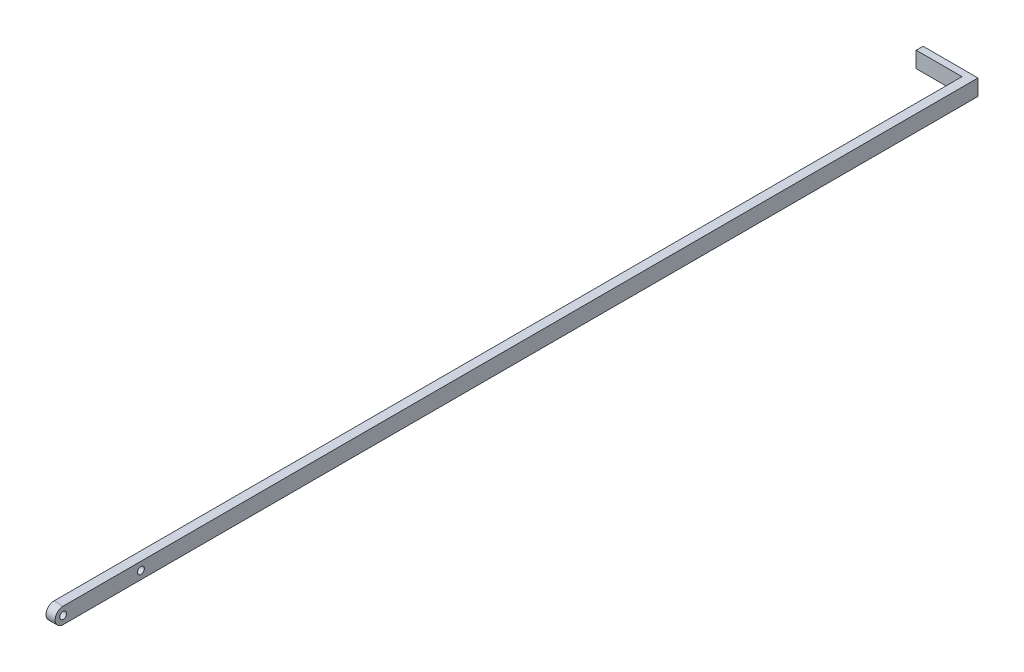
ISO-10303-21;
HEADER;
FILE_DESCRIPTION(('STEP AP214'),'2;1');
FILE_NAME('part.step','',(''),(''),'','','');
FILE_SCHEMA(('AUTOMOTIVE_DESIGN { 1 0 10303 214 1 1 1 1 }'));
ENDSEC;
DATA;
#1=APPLICATION_CONTEXT('core data for automotive mechanical design processes');
#2=APPLICATION_PROTOCOL_DEFINITION('international standard','automotive_design',2000,#1);
#3=PRODUCT_CONTEXT('',#1,'mechanical');
#4=PRODUCT('Part','Part','',(#3));
#5=PRODUCT_RELATED_PRODUCT_CATEGORY('part','',(#4));
#6=PRODUCT_DEFINITION_FORMATION('','',#4);
#7=PRODUCT_DEFINITION_CONTEXT('part definition',#1,'design');
#8=PRODUCT_DEFINITION('design','',#6,#7);
#9=PRODUCT_DEFINITION_SHAPE('','',#8);
#10=(LENGTH_UNIT() NAMED_UNIT(*) SI_UNIT(.MILLI.,.METRE.));
#11=(NAMED_UNIT(*) PLANE_ANGLE_UNIT() SI_UNIT($,.RADIAN.));
#12=(NAMED_UNIT(*) SI_UNIT($,.STERADIAN.) SOLID_ANGLE_UNIT());
#13=UNCERTAINTY_MEASURE_WITH_UNIT(LENGTH_MEASURE(1.E-05),#10,'distance_accuracy_value','');
#14=(GEOMETRIC_REPRESENTATION_CONTEXT(3) GLOBAL_UNCERTAINTY_ASSIGNED_CONTEXT((#13)) GLOBAL_UNIT_ASSIGNED_CONTEXT((#10,
#11,#12)) REPRESENTATION_CONTEXT('',''));
#15=CARTESIAN_POINT('',(0.,0.,0.));
#16=DIRECTION('',(0.,0.,1.));
#17=DIRECTION('',(1.,0.,0.));
#18=AXIS2_PLACEMENT_3D('',#15,#16,#17);
#19=CARTESIAN_POINT('',(4.,3.5,0.));
#20=DIRECTION('',(1.,0.,0.));
#21=DIRECTION('',(0.,0.,-1.));
#22=AXIS2_PLACEMENT_3D('',#19,#20,#21);
#23=PLANE('',#22);
#24=CARTESIAN_POINT('',(4.,3.5,0.));
#25=DIRECTION('',(1.,0.,0.));
#26=DIRECTION('',(0.,0.,-1.));
#27=AXIS2_PLACEMENT_3D('',#24,#25,#26);
#28=CIRCLE('',#27,1.5);
#29=CARTESIAN_POINT('',(4.,3.5,-1.5));
#30=VERTEX_POINT('',#29);
#31=EDGE_CURVE('E146',#30,#30,#28,.T.);
#32=ORIENTED_EDGE('',*,*,#31,.F.);
#33=EDGE_LOOP('',(#32));
#34=FACE_BOUND('',#33,.T.);
#35=CARTESIAN_POINT('',(4.,3.5,0.));
#36=DIRECTION('',(1.,0.,0.));
#37=DIRECTION('',(0.,0.,-1.));
#38=AXIS2_PLACEMENT_3D('',#35,#36,#37);
#39=CIRCLE('',#38,3.5);
#40=CARTESIAN_POINT('',(4.,7.,0.));
#41=VERTEX_POINT('',#40);
#42=CARTESIAN_POINT('',(4.,0.,0.));
#43=VERTEX_POINT('',#42);
#44=EDGE_CURVE('E154',#41,#43,#39,.T.);
#45=ORIENTED_EDGE('',*,*,#44,.T.);
#46=DIRECTION('',(0.,0.,-1.));
#47=VECTOR('',#46,1.);
#48=CARTESIAN_POINT('',(4.,0.,0.));
#49=LINE('',#48,#47);
#50=CARTESIAN_POINT('',(4.,0.,-400.));
#51=VERTEX_POINT('',#50);
#52=EDGE_CURVE('E90',#43,#51,#49,.T.);
#53=ORIENTED_EDGE('',*,*,#52,.T.);
#54=DIRECTION('',(0.,1.,0.));
#55=VECTOR('',#54,1.);
#56=CARTESIAN_POINT('',(4.,7.,-400.));
#57=LINE('',#56,#55);
#58=CARTESIAN_POINT('',(4.,7.,-400.));
#59=VERTEX_POINT('',#58);
#60=EDGE_CURVE('E159',#51,#59,#57,.T.);
#61=ORIENTED_EDGE('',*,*,#60,.T.);
#62=DIRECTION('',(0.,0.,1.));
#63=VECTOR('',#62,1.);
#64=CARTESIAN_POINT('',(4.,7.,0.));
#65=LINE('',#64,#63);
#66=EDGE_CURVE('E68',#59,#41,#65,.T.);
#67=ORIENTED_EDGE('',*,*,#66,.T.);
#68=EDGE_LOOP('',(#45,#53,#61,#67));
#69=FACE_BOUND('',#68,.T.);
#70=CARTESIAN_POINT('',(4.,3.5,-34.));
#71=DIRECTION('',(1.,0.,0.));
#72=DIRECTION('',(0.,0.,-1.));
#73=AXIS2_PLACEMENT_3D('',#70,#71,#72);
#74=CIRCLE('',#73,1.5);
#75=CARTESIAN_POINT('',(4.,3.5,-35.5));
#76=VERTEX_POINT('',#75);
#77=EDGE_CURVE('E138',#76,#76,#74,.T.);
#78=ORIENTED_EDGE('',*,*,#77,.F.);
#79=EDGE_LOOP('',(#78));
#80=FACE_BOUND('',#79,.T.);
#81=ADVANCED_FACE('F43',(#34,#69,#80),#23,.T.);
#82=CARTESIAN_POINT('',(0.,3.5,0.));
#83=DIRECTION('',(1.,0.,0.));
#84=DIRECTION('',(0.,0.,-1.));
#85=AXIS2_PLACEMENT_3D('',#82,#83,#84);
#86=PLANE('',#85);
#87=DIRECTION('',(0.,0.,1.));
#88=VECTOR('',#87,1.);
#89=CARTESIAN_POINT('',(0.,7.,0.));
#90=LINE('',#89,#88);
#91=CARTESIAN_POINT('',(0.,7.,-397.));
#92=VERTEX_POINT('',#91);
#93=CARTESIAN_POINT('',(0.,7.,0.));
#94=VERTEX_POINT('',#93);
#95=EDGE_CURVE('E83',#92,#94,#90,.T.);
#96=ORIENTED_EDGE('',*,*,#95,.F.);
#97=DIRECTION('',(0.,-1.,0.));
#98=VECTOR('',#97,1.);
#99=CARTESIAN_POINT('',(0.,7.,-397.));
#100=LINE('',#99,#98);
#101=CARTESIAN_POINT('',(0.,0.,-397.));
#102=VERTEX_POINT('',#101);
#103=EDGE_CURVE('E126',#92,#102,#100,.T.);
#104=ORIENTED_EDGE('',*,*,#103,.T.);
#105=DIRECTION('',(0.,0.,-1.));
#106=VECTOR('',#105,1.);
#107=CARTESIAN_POINT('',(0.,0.,0.));
#108=LINE('',#107,#106);
#109=CARTESIAN_POINT('',(0.,0.,0.));
#110=VERTEX_POINT('',#109);
#111=EDGE_CURVE('E124',#110,#102,#108,.T.);
#112=ORIENTED_EDGE('',*,*,#111,.F.);
#113=CARTESIAN_POINT('',(0.,3.5,0.));
#114=DIRECTION('',(1.,0.,0.));
#115=DIRECTION('',(0.,0.,-1.));
#116=AXIS2_PLACEMENT_3D('',#113,#114,#115);
#117=CIRCLE('',#116,3.5);
#118=EDGE_CURVE('E150',#94,#110,#117,.T.);
#119=ORIENTED_EDGE('',*,*,#118,.F.);
#120=EDGE_LOOP('',(#96,#104,#112,#119));
#121=FACE_BOUND('',#120,.T.);
#122=CARTESIAN_POINT('',(0.,3.5,0.));
#123=DIRECTION('',(1.,0.,0.));
#124=DIRECTION('',(0.,0.,-1.));
#125=AXIS2_PLACEMENT_3D('',#122,#123,#124);
#126=CIRCLE('',#125,1.5);
#127=CARTESIAN_POINT('',(0.,3.5,-1.5));
#128=VERTEX_POINT('',#127);
#129=EDGE_CURVE('E142',#128,#128,#126,.T.);
#130=ORIENTED_EDGE('',*,*,#129,.T.);
#131=EDGE_LOOP('',(#130));
#132=FACE_BOUND('',#131,.T.);
#133=CARTESIAN_POINT('',(0.,3.5,-34.));
#134=DIRECTION('',(1.,0.,0.));
#135=DIRECTION('',(0.,0.,-1.));
#136=AXIS2_PLACEMENT_3D('',#133,#134,#135);
#137=CIRCLE('',#136,1.5);
#138=CARTESIAN_POINT('',(0.,3.5,-35.5));
#139=VERTEX_POINT('',#138);
#140=EDGE_CURVE('E136',#139,#139,#137,.T.);
#141=ORIENTED_EDGE('',*,*,#140,.T.);
#142=EDGE_LOOP('',(#141));
#143=FACE_BOUND('',#142,.T.);
#144=ADVANCED_FACE('F187',(#121,#132,#143),#86,.F.);
#145=CARTESIAN_POINT('',(4.,3.5,0.));
#146=DIRECTION('',(-1.,0.,0.));
#147=DIRECTION('',(0.,0.,1.));
#148=AXIS2_PLACEMENT_3D('',#145,#146,#147);
#149=CYLINDRICAL_SURFACE('',#148,3.5);
#150=ORIENTED_EDGE('',*,*,#118,.T.);
#151=DIRECTION('',(-1.,0.,0.));
#152=VECTOR('',#151,1.);
#153=CARTESIAN_POINT('',(4.,0.,0.));
#154=LINE('',#153,#152);
#155=EDGE_CURVE('E11',#43,#110,#154,.T.);
#156=ORIENTED_EDGE('',*,*,#155,.F.);
#157=ORIENTED_EDGE('',*,*,#44,.F.);
#158=DIRECTION('',(-1.,0.,0.));
#159=VECTOR('',#158,1.);
#160=CARTESIAN_POINT('',(4.,7.,0.));
#161=LINE('',#160,#159);
#162=EDGE_CURVE('E164',#41,#94,#161,.T.);
#163=ORIENTED_EDGE('',*,*,#162,.T.);
#164=EDGE_LOOP('',(#150,#156,#157,#163));
#165=FACE_BOUND('',#164,.T.);
#166=ADVANCED_FACE('F45',(#165),#149,.T.);
#167=CARTESIAN_POINT('',(4.,0.,0.));
#168=DIRECTION('',(0.,1.,0.));
#169=DIRECTION('',(0.,0.,1.));
#170=AXIS2_PLACEMENT_3D('',#167,#168,#169);
#171=PLANE('',#170);
#172=ORIENTED_EDGE('',*,*,#111,.T.);
#173=DIRECTION('',(-1.,0.,0.));
#174=VECTOR('',#173,1.);
#175=CARTESIAN_POINT('',(-20.,0.,-397.));
#176=LINE('',#175,#174);
#177=CARTESIAN_POINT('',(-20.,0.,-397.));
#178=VERTEX_POINT('',#177);
#179=EDGE_CURVE('E59',#102,#178,#176,.T.);
#180=ORIENTED_EDGE('',*,*,#179,.T.);
#181=DIRECTION('',(0.,0.,-1.));
#182=VECTOR('',#181,1.);
#183=CARTESIAN_POINT('',(-20.,0.,-397.));
#184=LINE('',#183,#182);
#185=CARTESIAN_POINT('',(-20.,0.,-400.));
#186=VERTEX_POINT('',#185);
#187=EDGE_CURVE('E108',#178,#186,#184,.T.);
#188=ORIENTED_EDGE('',*,*,#187,.T.);
#189=DIRECTION('',(-1.,0.,0.));
#190=VECTOR('',#189,1.);
#191=CARTESIAN_POINT('',(4.,0.,-400.));
#192=LINE('',#191,#190);
#193=EDGE_CURVE('E52',#51,#186,#192,.T.);
#194=ORIENTED_EDGE('',*,*,#193,.F.);
#195=ORIENTED_EDGE('',*,*,#52,.F.);
#196=ORIENTED_EDGE('',*,*,#155,.T.);
#197=EDGE_LOOP('',(#172,#180,#188,#194,#195,#196));
#198=FACE_BOUND('',#197,.T.);
#199=ADVANCED_FACE('F123',(#198),#171,.F.);
#200=CARTESIAN_POINT('',(4.,7.,-400.));
#201=DIRECTION('',(0.,0.,1.));
#202=DIRECTION('',(1.,0.,0.));
#203=AXIS2_PLACEMENT_3D('',#200,#201,#202);
#204=PLANE('',#203);
#205=ORIENTED_EDGE('',*,*,#193,.T.);
#206=DIRECTION('',(0.,1.,0.));
#207=VECTOR('',#206,1.);
#208=CARTESIAN_POINT('',(-20.,7.,-400.));
#209=LINE('',#208,#207);
#210=CARTESIAN_POINT('',(-20.,7.,-400.));
#211=VERTEX_POINT('',#210);
#212=EDGE_CURVE('E114',#186,#211,#209,.T.);
#213=ORIENTED_EDGE('',*,*,#212,.T.);
#214=DIRECTION('',(-1.,0.,0.));
#215=VECTOR('',#214,1.);
#216=CARTESIAN_POINT('',(4.,7.,-400.));
#217=LINE('',#216,#215);
#218=EDGE_CURVE('E174',#59,#211,#217,.T.);
#219=ORIENTED_EDGE('',*,*,#218,.F.);
#220=ORIENTED_EDGE('',*,*,#60,.F.);
#221=EDGE_LOOP('',(#205,#213,#219,#220));
#222=FACE_BOUND('',#221,.T.);
#223=ADVANCED_FACE('F179',(#222),#204,.F.);
#224=CARTESIAN_POINT('',(4.,7.,0.));
#225=DIRECTION('',(0.,-1.,0.));
#226=DIRECTION('',(0.,0.,-1.));
#227=AXIS2_PLACEMENT_3D('',#224,#225,#226);
#228=PLANE('',#227);
#229=ORIENTED_EDGE('',*,*,#218,.T.);
#230=DIRECTION('',(0.,0.,-1.));
#231=VECTOR('',#230,1.);
#232=CARTESIAN_POINT('',(-20.,7.,-397.));
#233=LINE('',#232,#231);
#234=CARTESIAN_POINT('',(-20.,7.,-397.));
#235=VERTEX_POINT('',#234);
#236=EDGE_CURVE('E116',#235,#211,#233,.T.);
#237=ORIENTED_EDGE('',*,*,#236,.F.);
#238=DIRECTION('',(1.,0.,0.));
#239=VECTOR('',#238,1.);
#240=CARTESIAN_POINT('',(0.,7.,-397.));
#241=LINE('',#240,#239);
#242=EDGE_CURVE('E117',#235,#92,#241,.T.);
#243=ORIENTED_EDGE('',*,*,#242,.T.);
#244=ORIENTED_EDGE('',*,*,#95,.T.);
#245=ORIENTED_EDGE('',*,*,#162,.F.);
#246=ORIENTED_EDGE('',*,*,#66,.F.);
#247=EDGE_LOOP('',(#229,#237,#243,#244,#245,#246));
#248=FACE_BOUND('',#247,.T.);
#249=ADVANCED_FACE('F189',(#248),#228,.F.);
#250=CARTESIAN_POINT('',(4.,3.5,0.));
#251=DIRECTION('',(-1.,0.,0.));
#252=DIRECTION('',(0.,0.,1.));
#253=AXIS2_PLACEMENT_3D('',#250,#251,#252);
#254=CYLINDRICAL_SURFACE('',#253,1.5);
#255=ORIENTED_EDGE('',*,*,#31,.T.);
#256=EDGE_LOOP('',(#255));
#257=FACE_BOUND('',#256,.T.);
#258=ORIENTED_EDGE('',*,*,#129,.F.);
#259=EDGE_LOOP('',(#258));
#260=FACE_BOUND('',#259,.T.);
#261=ADVANCED_FACE('F191',(#257,#260),#254,.F.);
#262=CARTESIAN_POINT('',(4.,3.5,-34.));
#263=DIRECTION('',(-1.,0.,0.));
#264=DIRECTION('',(0.,0.,1.));
#265=AXIS2_PLACEMENT_3D('',#262,#263,#264);
#266=CYLINDRICAL_SURFACE('',#265,1.5);
#267=ORIENTED_EDGE('',*,*,#77,.T.);
#268=EDGE_LOOP('',(#267));
#269=FACE_BOUND('',#268,.T.);
#270=ORIENTED_EDGE('',*,*,#140,.F.);
#271=EDGE_LOOP('',(#270));
#272=FACE_BOUND('',#271,.T.);
#273=ADVANCED_FACE('F197',(#269,#272),#266,.F.);
#274=CARTESIAN_POINT('',(-20.,7.,-397.));
#275=DIRECTION('',(-1.,0.,0.));
#276=DIRECTION('',(0.,-1.,0.));
#277=AXIS2_PLACEMENT_3D('',#274,#275,#276);
#278=PLANE('',#277);
#279=ORIENTED_EDGE('',*,*,#212,.F.);
#280=ORIENTED_EDGE('',*,*,#187,.F.);
#281=DIRECTION('',(0.,1.,0.));
#282=VECTOR('',#281,1.);
#283=CARTESIAN_POINT('',(-20.,7.,-397.));
#284=LINE('',#283,#282);
#285=EDGE_CURVE('E111',#178,#235,#284,.T.);
#286=ORIENTED_EDGE('',*,*,#285,.T.);
#287=ORIENTED_EDGE('',*,*,#236,.T.);
#288=EDGE_LOOP('',(#279,#280,#286,#287));
#289=FACE_BOUND('',#288,.T.);
#290=ADVANCED_FACE('F109',(#289),#278,.T.);
#291=CARTESIAN_POINT('',(0.,0.,-397.));
#292=DIRECTION('',(0.,0.,1.));
#293=DIRECTION('',(1.,0.,0.));
#294=AXIS2_PLACEMENT_3D('',#291,#292,#293);
#295=PLANE('',#294);
#296=ORIENTED_EDGE('',*,*,#103,.F.);
#297=ORIENTED_EDGE('',*,*,#242,.F.);
#298=ORIENTED_EDGE('',*,*,#285,.F.);
#299=ORIENTED_EDGE('',*,*,#179,.F.);
#300=EDGE_LOOP('',(#296,#297,#298,#299));
#301=FACE_BOUND('',#300,.T.);
#302=ADVANCED_FACE('F119',(#301),#295,.T.);
#303=CLOSED_SHELL('',(#81,#144,#166,#199,#223,#249,#261,#273,#290,#302));
#304=MANIFOLD_SOLID_BREP('B2',#303);
#305=ADVANCED_BREP_SHAPE_REPRESENTATION('',(#18,#304),#14);
#306=SHAPE_DEFINITION_REPRESENTATION(#9,#305);
ENDSEC;
END-ISO-10303-21;
